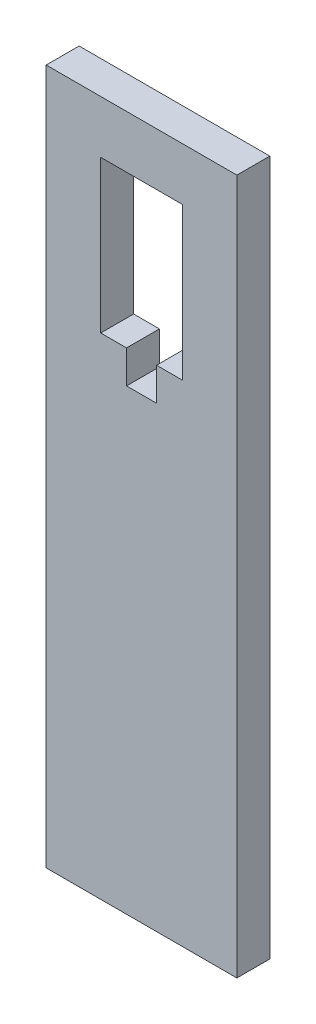
ISO-10303-21;
HEADER;
FILE_DESCRIPTION(('STEP AP214'),'2;1');
FILE_NAME('part.step','',(''),(''),'','','');
FILE_SCHEMA(('AUTOMOTIVE_DESIGN { 1 0 10303 214 1 1 1 1 }'));
ENDSEC;
DATA;
#1=APPLICATION_CONTEXT('core data for automotive mechanical design processes');
#2=APPLICATION_PROTOCOL_DEFINITION('international standard','automotive_design',2000,#1);
#3=PRODUCT_CONTEXT('',#1,'mechanical');
#4=PRODUCT('Part','Part','',(#3));
#5=PRODUCT_RELATED_PRODUCT_CATEGORY('part','',(#4));
#6=PRODUCT_DEFINITION_FORMATION('','',#4);
#7=PRODUCT_DEFINITION_CONTEXT('part definition',#1,'design');
#8=PRODUCT_DEFINITION('design','',#6,#7);
#9=PRODUCT_DEFINITION_SHAPE('','',#8);
#10=(LENGTH_UNIT() NAMED_UNIT(*) SI_UNIT(.MILLI.,.METRE.));
#11=(NAMED_UNIT(*) PLANE_ANGLE_UNIT() SI_UNIT($,.RADIAN.));
#12=(NAMED_UNIT(*) SI_UNIT($,.STERADIAN.) SOLID_ANGLE_UNIT());
#13=UNCERTAINTY_MEASURE_WITH_UNIT(LENGTH_MEASURE(1.E-05),#10,'distance_accuracy_value','');
#14=(GEOMETRIC_REPRESENTATION_CONTEXT(3) GLOBAL_UNCERTAINTY_ASSIGNED_CONTEXT((#13)) GLOBAL_UNIT_ASSIGNED_CONTEXT((#10,
#11,#12)) REPRESENTATION_CONTEXT('',''));
#15=CARTESIAN_POINT('',(0.,0.,0.));
#16=DIRECTION('',(0.,0.,1.));
#17=DIRECTION('',(1.,0.,0.));
#18=AXIS2_PLACEMENT_3D('',#15,#16,#17);
#19=CARTESIAN_POINT('',(-18.5582300884956,31.0897345132743,5.));
#20=DIRECTION('',(0.,-1.,0.));
#21=DIRECTION('',(0.,0.,-1.));
#22=AXIS2_PLACEMENT_3D('',#19,#20,#21);
#23=PLANE('',#22);
#24=DIRECTION('',(-1.,0.,0.));
#25=VECTOR('',#24,1.);
#26=CARTESIAN_POINT('',(-18.5582300884956,31.0897345132743,5.));
#27=LINE('',#26,#25);
#28=CARTESIAN_POINT('',(-6.35823008849556,31.0897345132743,5.));
#29=VERTEX_POINT('',#28);
#30=CARTESIAN_POINT('',(-10.2782300884956,31.0897345132743,5.));
#31=VERTEX_POINT('',#30);
#32=EDGE_CURVE('E241',#29,#31,#27,.T.);
#33=ORIENTED_EDGE('',*,*,#32,.F.);
#34=DIRECTION('',(0.,0.,1.));
#35=VECTOR('',#34,1.);
#36=CARTESIAN_POINT('',(-6.35823008849556,31.0897345132743,0.));
#37=LINE('',#36,#35);
#38=CARTESIAN_POINT('',(-6.35823008849556,31.0897345132743,0.));
#39=VERTEX_POINT('',#38);
#40=EDGE_CURVE('E136',#39,#29,#37,.T.);
#41=ORIENTED_EDGE('',*,*,#40,.F.);
#42=DIRECTION('',(-1.,0.,0.));
#43=VECTOR('',#42,1.);
#44=CARTESIAN_POINT('',(-18.5582300884956,31.0897345132743,0.));
#45=LINE('',#44,#43);
#46=CARTESIAN_POINT('',(-10.2782300884956,31.0897345132743,0.));
#47=VERTEX_POINT('',#46);
#48=EDGE_CURVE('E253',#39,#47,#45,.T.);
#49=ORIENTED_EDGE('',*,*,#48,.T.);
#50=DIRECTION('',(0.,0.,-1.));
#51=VECTOR('',#50,1.);
#52=CARTESIAN_POINT('',(-10.2782300884956,31.0897345132743,0.));
#53=LINE('',#52,#51);
#54=EDGE_CURVE('E213',#31,#47,#53,.T.);
#55=ORIENTED_EDGE('',*,*,#54,.F.);
#56=EDGE_LOOP('',(#33,#41,#49,#55));
#57=FACE_BOUND('',#56,.T.);
#58=ADVANCED_FACE('F39',(#57),#23,.F.);
#59=CARTESIAN_POINT('',(2.12176991150444,31.0897345132743,0.));
#60=VERTEX_POINT('',#59);
#61=CARTESIAN_POINT('',(-1.79823008849555,31.0897345132743,0.));
#62=VERTEX_POINT('',#61);
#63=EDGE_CURVE('E235',#60,#62,#45,.T.);
#64=ORIENTED_EDGE('',*,*,#63,.T.);
#65=DIRECTION('',(0.,0.,-1.));
#66=VECTOR('',#65,1.);
#67=CARTESIAN_POINT('',(-1.79823008849555,31.0897345132743,0.));
#68=LINE('',#67,#66);
#69=CARTESIAN_POINT('',(-1.79823008849555,31.0897345132743,5.));
#70=VERTEX_POINT('',#69);
#71=EDGE_CURVE('E150',#70,#62,#68,.T.);
#72=ORIENTED_EDGE('',*,*,#71,.F.);
#73=CARTESIAN_POINT('',(2.12176991150444,31.0897345132743,5.));
#74=VERTEX_POINT('',#73);
#75=EDGE_CURVE('E63',#74,#70,#27,.T.);
#76=ORIENTED_EDGE('',*,*,#75,.F.);
#77=DIRECTION('',(0.,0.,1.));
#78=VECTOR('',#77,1.);
#79=CARTESIAN_POINT('',(2.12176991150444,31.0897345132743,0.));
#80=LINE('',#79,#78);
#81=EDGE_CURVE('E192',#60,#74,#80,.T.);
#82=ORIENTED_EDGE('',*,*,#81,.F.);
#83=EDGE_LOOP('',(#64,#72,#76,#82));
#84=FACE_BOUND('',#83,.T.);
#85=ADVANCED_FACE('F281',(#84),#23,.F.);
#86=CARTESIAN_POINT('',(-18.5582300884956,31.0897345132743,5.));
#87=DIRECTION('',(1.,0.,0.));
#88=DIRECTION('',(0.,1.,0.));
#89=AXIS2_PLACEMENT_3D('',#86,#87,#88);
#90=PLANE('',#89);
#91=DIRECTION('',(0.,-1.,0.));
#92=VECTOR('',#91,1.);
#93=CARTESIAN_POINT('',(-18.5582300884956,31.0897345132743,0.));
#94=LINE('',#93,#92);
#95=CARTESIAN_POINT('',(-18.5582300884956,62.1997345132743,0.));
#96=VERTEX_POINT('',#95);
#97=CARTESIAN_POINT('',(-18.5582300884955,-43.4102654867257,0.));
#98=VERTEX_POINT('',#97);
#99=EDGE_CURVE('E229',#96,#98,#94,.T.);
#100=ORIENTED_EDGE('',*,*,#99,.T.);
#101=DIRECTION('',(0.,0.,-1.));
#102=VECTOR('',#101,1.);
#103=CARTESIAN_POINT('',(-18.5582300884955,-43.4102654867257,5.));
#104=LINE('',#103,#102);
#105=CARTESIAN_POINT('',(-18.5582300884955,-43.4102654867257,5.));
#106=VERTEX_POINT('',#105);
#107=EDGE_CURVE('E11',#106,#98,#104,.T.);
#108=ORIENTED_EDGE('',*,*,#107,.F.);
#109=DIRECTION('',(0.,-1.,0.));
#110=VECTOR('',#109,1.);
#111=CARTESIAN_POINT('',(-18.5582300884956,31.0897345132743,5.));
#112=LINE('',#111,#110);
#113=CARTESIAN_POINT('',(-18.5582300884956,62.1997345132743,5.));
#114=VERTEX_POINT('',#113);
#115=EDGE_CURVE('E230',#114,#106,#112,.T.);
#116=ORIENTED_EDGE('',*,*,#115,.F.);
#117=DIRECTION('',(0.,0.,1.));
#118=VECTOR('',#117,1.);
#119=CARTESIAN_POINT('',(-18.5582300884956,62.1997345132743,0.));
#120=LINE('',#119,#118);
#121=EDGE_CURVE('E175',#96,#114,#120,.T.);
#122=ORIENTED_EDGE('',*,*,#121,.F.);
#123=EDGE_LOOP('',(#100,#108,#116,#122));
#124=FACE_BOUND('',#123,.T.);
#125=ADVANCED_FACE('F41',(#124),#90,.F.);
#126=CARTESIAN_POINT('',(-18.5582300884955,-43.4102654867257,5.));
#127=DIRECTION('',(0.,1.,0.));
#128=DIRECTION('',(0.,0.,1.));
#129=AXIS2_PLACEMENT_3D('',#126,#127,#128);
#130=PLANE('',#129);
#131=DIRECTION('',(1.,0.,0.));
#132=VECTOR('',#131,1.);
#133=CARTESIAN_POINT('',(-18.5582300884955,-43.4102654867257,0.));
#134=LINE('',#133,#132);
#135=CARTESIAN_POINT('',(10.4017699115045,-43.4102654867257,0.));
#136=VERTEX_POINT('',#135);
#137=EDGE_CURVE('E247',#98,#136,#134,.T.);
#138=ORIENTED_EDGE('',*,*,#137,.T.);
#139=DIRECTION('',(0.,0.,-1.));
#140=VECTOR('',#139,1.);
#141=CARTESIAN_POINT('',(10.4017699115045,-43.4102654867257,5.));
#142=LINE('',#141,#140);
#143=CARTESIAN_POINT('',(10.4017699115045,-43.4102654867257,5.));
#144=VERTEX_POINT('',#143);
#145=EDGE_CURVE('E48',#144,#136,#142,.T.);
#146=ORIENTED_EDGE('',*,*,#145,.F.);
#147=DIRECTION('',(1.,0.,0.));
#148=VECTOR('',#147,1.);
#149=CARTESIAN_POINT('',(-18.5582300884955,-43.4102654867257,5.));
#150=LINE('',#149,#148);
#151=EDGE_CURVE('E234',#106,#144,#150,.T.);
#152=ORIENTED_EDGE('',*,*,#151,.F.);
#153=ORIENTED_EDGE('',*,*,#107,.T.);
#154=EDGE_LOOP('',(#138,#146,#152,#153));
#155=FACE_BOUND('',#154,.T.);
#156=ADVANCED_FACE('F274',(#155),#130,.F.);
#157=CARTESIAN_POINT('',(10.4017699115044,31.0897345132743,5.));
#158=DIRECTION('',(-1.,0.,0.));
#159=DIRECTION('',(0.,-1.,0.));
#160=AXIS2_PLACEMENT_3D('',#157,#158,#159);
#161=PLANE('',#160);
#162=DIRECTION('',(0.,1.,0.));
#163=VECTOR('',#162,1.);
#164=CARTESIAN_POINT('',(10.4017699115044,31.0897345132743,0.));
#165=LINE('',#164,#163);
#166=CARTESIAN_POINT('',(10.4017699115044,62.1997345132743,0.));
#167=VERTEX_POINT('',#166);
#168=EDGE_CURVE('E250',#136,#167,#165,.T.);
#169=ORIENTED_EDGE('',*,*,#168,.T.);
#170=DIRECTION('',(0.,0.,-1.));
#171=VECTOR('',#170,1.);
#172=CARTESIAN_POINT('',(10.4017699115044,62.1997345132743,0.));
#173=LINE('',#172,#171);
#174=CARTESIAN_POINT('',(10.4017699115044,62.1997345132743,5.));
#175=VERTEX_POINT('',#174);
#176=EDGE_CURVE('E184',#175,#167,#173,.T.);
#177=ORIENTED_EDGE('',*,*,#176,.F.);
#178=DIRECTION('',(0.,1.,0.));
#179=VECTOR('',#178,1.);
#180=CARTESIAN_POINT('',(10.4017699115044,31.0897345132743,5.));
#181=LINE('',#180,#179);
#182=EDGE_CURVE('E238',#144,#175,#181,.T.);
#183=ORIENTED_EDGE('',*,*,#182,.F.);
#184=ORIENTED_EDGE('',*,*,#145,.T.);
#185=EDGE_LOOP('',(#169,#177,#183,#184));
#186=FACE_BOUND('',#185,.T.);
#187=ADVANCED_FACE('F262',(#186),#161,.F.);
#188=CARTESIAN_POINT('',(0.,0.,5.));
#189=DIRECTION('',(0.,0.,1.));
#190=DIRECTION('',(1.,0.,0.));
#191=AXIS2_PLACEMENT_3D('',#188,#189,#190);
#192=PLANE('',#191);
#193=DIRECTION('',(0.,1.,0.));
#194=VECTOR('',#193,1.);
#195=CARTESIAN_POINT('',(-6.35823008849556,26.0897345132743,5.));
#196=LINE('',#195,#194);
#197=CARTESIAN_POINT('',(-6.35823008849556,26.0897345132743,5.));
#198=VERTEX_POINT('',#197);
#199=EDGE_CURVE('E131',#198,#29,#196,.T.);
#200=ORIENTED_EDGE('',*,*,#199,.T.);
#201=ORIENTED_EDGE('',*,*,#32,.T.);
#202=DIRECTION('',(0.,-1.,0.));
#203=VECTOR('',#202,1.);
#204=CARTESIAN_POINT('',(-10.2782300884956,54.1997345132743,5.));
#205=LINE('',#204,#203);
#206=CARTESIAN_POINT('',(-10.2782300884956,54.1997345132743,5.));
#207=VERTEX_POINT('',#206);
#208=EDGE_CURVE('E225',#207,#31,#205,.T.);
#209=ORIENTED_EDGE('',*,*,#208,.F.);
#210=DIRECTION('',(1.,0.,0.));
#211=VECTOR('',#210,1.);
#212=CARTESIAN_POINT('',(-18.5582300884956,54.1997345132743,5.));
#213=LINE('',#212,#211);
#214=CARTESIAN_POINT('',(2.12176991150444,54.1997345132743,5.));
#215=VERTEX_POINT('',#214);
#216=EDGE_CURVE('E168',#207,#215,#213,.T.);
#217=ORIENTED_EDGE('',*,*,#216,.T.);
#218=DIRECTION('',(0.,-1.,0.));
#219=VECTOR('',#218,1.);
#220=CARTESIAN_POINT('',(2.12176991150444,54.1997345132743,5.));
#221=LINE('',#220,#219);
#222=EDGE_CURVE('E203',#215,#74,#221,.T.);
#223=ORIENTED_EDGE('',*,*,#222,.T.);
#224=ORIENTED_EDGE('',*,*,#75,.T.);
#225=DIRECTION('',(0.,1.,0.));
#226=VECTOR('',#225,1.);
#227=CARTESIAN_POINT('',(-1.79823008849555,26.0897345132743,5.));
#228=LINE('',#227,#226);
#229=CARTESIAN_POINT('',(-1.79823008849555,26.0897345132743,5.));
#230=VERTEX_POINT('',#229);
#231=EDGE_CURVE('E141',#230,#70,#228,.T.);
#232=ORIENTED_EDGE('',*,*,#231,.F.);
#233=DIRECTION('',(1.,0.,0.));
#234=VECTOR('',#233,1.);
#235=CARTESIAN_POINT('',(-6.35823008849556,26.0897345132743,5.));
#236=LINE('',#235,#234);
#237=EDGE_CURVE('E145',#198,#230,#236,.T.);
#238=ORIENTED_EDGE('',*,*,#237,.F.);
#239=EDGE_LOOP('',(#200,#201,#209,#217,#223,#224,#232,#238));
#240=FACE_BOUND('',#239,.T.);
#241=ORIENTED_EDGE('',*,*,#115,.T.);
#242=ORIENTED_EDGE('',*,*,#151,.T.);
#243=ORIENTED_EDGE('',*,*,#182,.T.);
#244=DIRECTION('',(1.,0.,0.));
#245=VECTOR('',#244,1.);
#246=CARTESIAN_POINT('',(-18.5582300884956,62.1997345132743,5.));
#247=LINE('',#246,#245);
#248=EDGE_CURVE('E179',#114,#175,#247,.T.);
#249=ORIENTED_EDGE('',*,*,#248,.F.);
#250=EDGE_LOOP('',(#241,#242,#243,#249));
#251=FACE_BOUND('',#250,.T.);
#252=ADVANCED_FACE('F152',(#240,#251),#192,.T.);
#253=CARTESIAN_POINT('',(0.,0.,0.));
#254=DIRECTION('',(0.,0.,1.));
#255=DIRECTION('',(1.,0.,0.));
#256=AXIS2_PLACEMENT_3D('',#253,#254,#255);
#257=PLANE('',#256);
#258=ORIENTED_EDGE('',*,*,#48,.F.);
#259=DIRECTION('',(0.,1.,0.));
#260=VECTOR('',#259,1.);
#261=CARTESIAN_POINT('',(-6.35823008849556,26.0897345132743,0.));
#262=LINE('',#261,#260);
#263=CARTESIAN_POINT('',(-6.35823008849556,26.0897345132743,0.));
#264=VERTEX_POINT('',#263);
#265=EDGE_CURVE('E165',#264,#39,#262,.T.);
#266=ORIENTED_EDGE('',*,*,#265,.F.);
#267=DIRECTION('',(-1.,0.,0.));
#268=VECTOR('',#267,1.);
#269=CARTESIAN_POINT('',(-6.35823008849556,26.0897345132743,0.));
#270=LINE('',#269,#268);
#271=CARTESIAN_POINT('',(-1.79823008849555,26.0897345132743,0.));
#272=VERTEX_POINT('',#271);
#273=EDGE_CURVE('E142',#272,#264,#270,.T.);
#274=ORIENTED_EDGE('',*,*,#273,.F.);
#275=DIRECTION('',(0.,1.,0.));
#276=VECTOR('',#275,1.);
#277=CARTESIAN_POINT('',(-1.79823008849555,26.0897345132743,0.));
#278=LINE('',#277,#276);
#279=EDGE_CURVE('E169',#272,#62,#278,.T.);
#280=ORIENTED_EDGE('',*,*,#279,.T.);
#281=ORIENTED_EDGE('',*,*,#63,.F.);
#282=DIRECTION('',(0.,-1.,0.));
#283=VECTOR('',#282,1.);
#284=CARTESIAN_POINT('',(2.12176991150444,54.1997345132743,0.));
#285=LINE('',#284,#283);
#286=CARTESIAN_POINT('',(2.12176991150444,54.1997345132743,0.));
#287=VERTEX_POINT('',#286);
#288=EDGE_CURVE('E209',#287,#60,#285,.T.);
#289=ORIENTED_EDGE('',*,*,#288,.F.);
#290=DIRECTION('',(-1.,0.,0.));
#291=VECTOR('',#290,1.);
#292=CARTESIAN_POINT('',(-18.5582300884956,54.1997345132743,0.));
#293=LINE('',#292,#291);
#294=CARTESIAN_POINT('',(-10.2782300884956,54.1997345132743,0.));
#295=VERTEX_POINT('',#294);
#296=EDGE_CURVE('E180',#287,#295,#293,.T.);
#297=ORIENTED_EDGE('',*,*,#296,.T.);
#298=DIRECTION('',(0.,-1.,0.));
#299=VECTOR('',#298,1.);
#300=CARTESIAN_POINT('',(-10.2782300884956,54.1997345132743,0.));
#301=LINE('',#300,#299);
#302=EDGE_CURVE('E218',#295,#47,#301,.T.);
#303=ORIENTED_EDGE('',*,*,#302,.T.);
#304=EDGE_LOOP('',(#258,#266,#274,#280,#281,#289,#297,#303));
#305=FACE_BOUND('',#304,.T.);
#306=ORIENTED_EDGE('',*,*,#99,.F.);
#307=DIRECTION('',(-1.,0.,0.));
#308=VECTOR('',#307,1.);
#309=CARTESIAN_POINT('',(-18.5582300884956,62.1997345132743,0.));
#310=LINE('',#309,#308);
#311=EDGE_CURVE('E188',#167,#96,#310,.T.);
#312=ORIENTED_EDGE('',*,*,#311,.F.);
#313=ORIENTED_EDGE('',*,*,#168,.F.);
#314=ORIENTED_EDGE('',*,*,#137,.F.);
#315=EDGE_LOOP('',(#306,#312,#313,#314));
#316=FACE_BOUND('',#315,.T.);
#317=ADVANCED_FACE('F267',(#305,#316),#257,.F.);
#318=CARTESIAN_POINT('',(-10.2782300884956,54.1997345132743,0.));
#319=DIRECTION('',(-1.,0.,0.));
#320=DIRECTION('',(0.,0.,1.));
#321=AXIS2_PLACEMENT_3D('',#318,#319,#320);
#322=PLANE('',#321);
#323=ORIENTED_EDGE('',*,*,#54,.T.);
#324=ORIENTED_EDGE('',*,*,#302,.F.);
#325=DIRECTION('',(0.,0.,-1.));
#326=VECTOR('',#325,1.);
#327=CARTESIAN_POINT('',(-10.2782300884956,54.1997345132743,0.));
#328=LINE('',#327,#326);
#329=EDGE_CURVE('E214',#207,#295,#328,.T.);
#330=ORIENTED_EDGE('',*,*,#329,.F.);
#331=ORIENTED_EDGE('',*,*,#208,.T.);
#332=EDGE_LOOP('',(#323,#324,#330,#331));
#333=FACE_BOUND('',#332,.T.);
#334=ADVANCED_FACE('F291',(#333),#322,.F.);
#335=CARTESIAN_POINT('',(2.12176991150444,54.1997345132743,0.));
#336=DIRECTION('',(1.,0.,0.));
#337=DIRECTION('',(0.,0.,-1.));
#338=AXIS2_PLACEMENT_3D('',#335,#336,#337);
#339=PLANE('',#338);
#340=ORIENTED_EDGE('',*,*,#81,.T.);
#341=ORIENTED_EDGE('',*,*,#222,.F.);
#342=DIRECTION('',(0.,0.,1.));
#343=VECTOR('',#342,1.);
#344=CARTESIAN_POINT('',(2.12176991150444,54.1997345132743,0.));
#345=LINE('',#344,#343);
#346=EDGE_CURVE('E199',#287,#215,#345,.T.);
#347=ORIENTED_EDGE('',*,*,#346,.F.);
#348=ORIENTED_EDGE('',*,*,#288,.T.);
#349=EDGE_LOOP('',(#340,#341,#347,#348));
#350=FACE_BOUND('',#349,.T.);
#351=ADVANCED_FACE('F297',(#350),#339,.F.);
#352=CARTESIAN_POINT('',(0.,54.1997345132743,0.));
#353=DIRECTION('',(0.,1.,0.));
#354=DIRECTION('',(0.,0.,1.));
#355=AXIS2_PLACEMENT_3D('',#352,#353,#354);
#356=PLANE('',#355);
#357=ORIENTED_EDGE('',*,*,#216,.F.);
#358=ORIENTED_EDGE('',*,*,#329,.T.);
#359=ORIENTED_EDGE('',*,*,#296,.F.);
#360=ORIENTED_EDGE('',*,*,#346,.T.);
#361=EDGE_LOOP('',(#357,#358,#359,#360));
#362=FACE_BOUND('',#361,.T.);
#363=ADVANCED_FACE('F301',(#362),#356,.F.);
#364=CARTESIAN_POINT('',(0.,62.1997345132743,0.));
#365=DIRECTION('',(0.,1.,0.));
#366=DIRECTION('',(0.,0.,1.));
#367=AXIS2_PLACEMENT_3D('',#364,#365,#366);
#368=PLANE('',#367);
#369=ORIENTED_EDGE('',*,*,#121,.T.);
#370=ORIENTED_EDGE('',*,*,#248,.T.);
#371=ORIENTED_EDGE('',*,*,#176,.T.);
#372=ORIENTED_EDGE('',*,*,#311,.T.);
#373=EDGE_LOOP('',(#369,#370,#371,#372));
#374=FACE_BOUND('',#373,.T.);
#375=ADVANCED_FACE('F270',(#374),#368,.T.);
#376=CARTESIAN_POINT('',(-6.35823008849556,26.0897345132743,0.));
#377=DIRECTION('',(-1.,0.,0.));
#378=DIRECTION('',(0.,0.,1.));
#379=AXIS2_PLACEMENT_3D('',#376,#377,#378);
#380=PLANE('',#379);
#381=ORIENTED_EDGE('',*,*,#40,.T.);
#382=ORIENTED_EDGE('',*,*,#199,.F.);
#383=DIRECTION('',(0.,0.,1.));
#384=VECTOR('',#383,1.);
#385=CARTESIAN_POINT('',(-6.35823008849556,26.0897345132743,0.));
#386=LINE('',#385,#384);
#387=EDGE_CURVE('E134',#264,#198,#386,.T.);
#388=ORIENTED_EDGE('',*,*,#387,.F.);
#389=ORIENTED_EDGE('',*,*,#265,.T.);
#390=EDGE_LOOP('',(#381,#382,#388,#389));
#391=FACE_BOUND('',#390,.T.);
#392=ADVANCED_FACE('F133',(#391),#380,.F.);
#393=CARTESIAN_POINT('',(-1.79823008849555,26.0897345132743,0.));
#394=DIRECTION('',(1.,0.,0.));
#395=DIRECTION('',(0.,0.,-1.));
#396=AXIS2_PLACEMENT_3D('',#393,#394,#395);
#397=PLANE('',#396);
#398=ORIENTED_EDGE('',*,*,#71,.T.);
#399=ORIENTED_EDGE('',*,*,#279,.F.);
#400=DIRECTION('',(0.,0.,-1.));
#401=VECTOR('',#400,1.);
#402=CARTESIAN_POINT('',(-1.79823008849555,26.0897345132743,0.));
#403=LINE('',#402,#401);
#404=EDGE_CURVE('E55',#230,#272,#403,.T.);
#405=ORIENTED_EDGE('',*,*,#404,.F.);
#406=ORIENTED_EDGE('',*,*,#231,.T.);
#407=EDGE_LOOP('',(#398,#399,#405,#406));
#408=FACE_BOUND('',#407,.T.);
#409=ADVANCED_FACE('F310',(#408),#397,.F.);
#410=CARTESIAN_POINT('',(0.,26.0897345132743,0.));
#411=DIRECTION('',(0.,1.,0.));
#412=DIRECTION('',(0.,0.,1.));
#413=AXIS2_PLACEMENT_3D('',#410,#411,#412);
#414=PLANE('',#413);
#415=ORIENTED_EDGE('',*,*,#387,.T.);
#416=ORIENTED_EDGE('',*,*,#237,.T.);
#417=ORIENTED_EDGE('',*,*,#404,.T.);
#418=ORIENTED_EDGE('',*,*,#273,.T.);
#419=EDGE_LOOP('',(#415,#416,#417,#418));
#420=FACE_BOUND('',#419,.T.);
#421=ADVANCED_FACE('F144',(#420),#414,.T.);
#422=CLOSED_SHELL('',(#58,#85,#125,#156,#187,#252,#317,#334,#351,#363,#375,#392,#409,#421));
#423=MANIFOLD_SOLID_BREP('B2',#422);
#424=ADVANCED_BREP_SHAPE_REPRESENTATION('',(#18,#423),#14);
#425=SHAPE_DEFINITION_REPRESENTATION(#9,#424);
ENDSEC;
END-ISO-10303-21;
